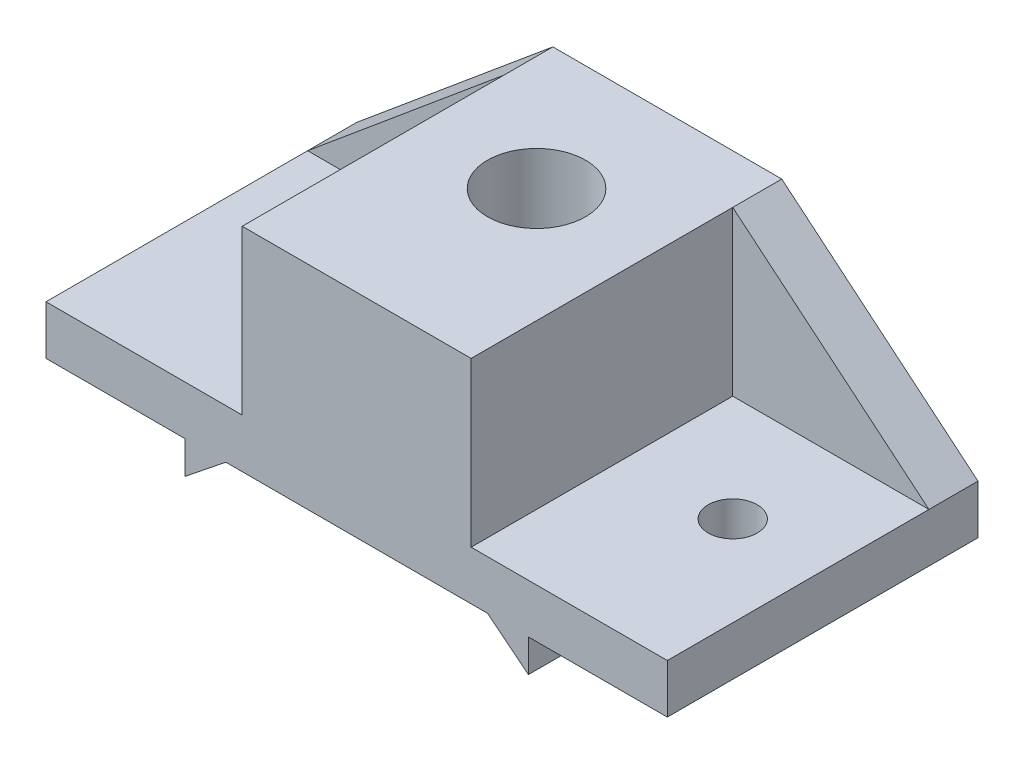
ISO-10303-21;
HEADER;
FILE_DESCRIPTION(('STEP AP214'),'2;1');
FILE_NAME('part.step','',(''),(''),'','','');
FILE_SCHEMA(('AUTOMOTIVE_DESIGN { 1 0 10303 214 1 1 1 1 }'));
ENDSEC;
DATA;
#1=APPLICATION_CONTEXT('core data for automotive mechanical design processes');
#2=APPLICATION_PROTOCOL_DEFINITION('international standard','automotive_design',2000,#1);
#3=PRODUCT_CONTEXT('',#1,'mechanical');
#4=PRODUCT('Part','Part','',(#3));
#5=PRODUCT_RELATED_PRODUCT_CATEGORY('part','',(#4));
#6=PRODUCT_DEFINITION_FORMATION('','',#4);
#7=PRODUCT_DEFINITION_CONTEXT('part definition',#1,'design');
#8=PRODUCT_DEFINITION('design','',#6,#7);
#9=PRODUCT_DEFINITION_SHAPE('','',#8);
#10=(LENGTH_UNIT() NAMED_UNIT(*) SI_UNIT(.MILLI.,.METRE.));
#11=(NAMED_UNIT(*) PLANE_ANGLE_UNIT() SI_UNIT($,.RADIAN.));
#12=(NAMED_UNIT(*) SI_UNIT($,.STERADIAN.) SOLID_ANGLE_UNIT());
#13=UNCERTAINTY_MEASURE_WITH_UNIT(LENGTH_MEASURE(1.E-05),#10,'distance_accuracy_value','');
#14=(GEOMETRIC_REPRESENTATION_CONTEXT(3) GLOBAL_UNCERTAINTY_ASSIGNED_CONTEXT((#13)) GLOBAL_UNIT_ASSIGNED_CONTEXT((#10,
#11,#12)) REPRESENTATION_CONTEXT('',''));
#15=CARTESIAN_POINT('',(0.,0.,0.));
#16=DIRECTION('',(0.,0.,1.));
#17=DIRECTION('',(1.,0.,0.));
#18=AXIS2_PLACEMENT_3D('',#15,#16,#17);
#19=CARTESIAN_POINT('',(17.,0.,38.));
#20=DIRECTION('',(1.,0.,0.));
#21=DIRECTION('',(0.,1.,0.));
#22=AXIS2_PLACEMENT_3D('',#19,#20,#21);
#23=PLANE('',#22);
#24=DIRECTION('',(0.,-1.,0.));
#25=VECTOR('',#24,1.);
#26=CARTESIAN_POINT('',(17.,0.,0.));
#27=LINE('',#26,#25);
#28=CARTESIAN_POINT('',(17.,0.,0.));
#29=VERTEX_POINT('',#28);
#30=CARTESIAN_POINT('',(17.,-4.,0.));
#31=VERTEX_POINT('',#30);
#32=EDGE_CURVE('E172',#29,#31,#27,.T.);
#33=ORIENTED_EDGE('',*,*,#32,.T.);
#34=DIRECTION('',(0.,0.,-1.));
#35=VECTOR('',#34,1.);
#36=CARTESIAN_POINT('',(17.,-4.,38.));
#37=LINE('',#36,#35);
#38=CARTESIAN_POINT('',(17.,-4.,38.));
#39=VERTEX_POINT('',#38);
#40=EDGE_CURVE('E11',#39,#31,#37,.T.);
#41=ORIENTED_EDGE('',*,*,#40,.F.);
#42=DIRECTION('',(0.,-1.,0.));
#43=VECTOR('',#42,1.);
#44=CARTESIAN_POINT('',(17.,0.,38.));
#45=LINE('',#44,#43);
#46=CARTESIAN_POINT('',(17.,0.,38.));
#47=VERTEX_POINT('',#46);
#48=EDGE_CURVE('E311',#47,#39,#45,.T.);
#49=ORIENTED_EDGE('',*,*,#48,.F.);
#50=DIRECTION('',(0.,0.,-1.));
#51=VECTOR('',#50,1.);
#52=CARTESIAN_POINT('',(17.,0.,38.));
#53=LINE('',#52,#51);
#54=EDGE_CURVE('E166',#47,#29,#53,.T.);
#55=ORIENTED_EDGE('',*,*,#54,.T.);
#56=EDGE_LOOP('',(#33,#41,#49,#55));
#57=FACE_BOUND('',#56,.T.);
#58=ADVANCED_FACE('F36',(#57),#23,.F.);
#59=CARTESIAN_POINT('',(8.58536585365853,-10.7317073170732,38.));
#60=DIRECTION('',(-0.624695047554424,0.780868809443031,0.));
#61=DIRECTION('',(-0.780868809443031,-0.624695047554424,0.));
#62=AXIS2_PLACEMENT_3D('',#59,#60,#61);
#63=PLANE('',#62);
#64=DIRECTION('',(0.780868809443031,0.624695047554424,0.));
#65=VECTOR('',#64,1.);
#66=CARTESIAN_POINT('',(8.58536585365853,-10.7317073170732,0.));
#67=LINE('',#66,#65);
#68=CARTESIAN_POINT('',(22.,0.,0.));
#69=VERTEX_POINT('',#68);
#70=EDGE_CURVE('E176',#31,#69,#67,.T.);
#71=ORIENTED_EDGE('',*,*,#70,.T.);
#72=DIRECTION('',(0.,0.,-1.));
#73=VECTOR('',#72,1.);
#74=CARTESIAN_POINT('',(22.,0.,38.));
#75=LINE('',#74,#73);
#76=CARTESIAN_POINT('',(22.,0.,38.));
#77=VERTEX_POINT('',#76);
#78=EDGE_CURVE('E46',#77,#69,#75,.T.);
#79=ORIENTED_EDGE('',*,*,#78,.F.);
#80=DIRECTION('',(0.780868809443031,0.624695047554424,0.));
#81=VECTOR('',#80,1.);
#82=CARTESIAN_POINT('',(8.58536585365853,-10.7317073170732,38.));
#83=LINE('',#82,#81);
#84=EDGE_CURVE('E101',#39,#77,#83,.T.);
#85=ORIENTED_EDGE('',*,*,#84,.F.);
#86=ORIENTED_EDGE('',*,*,#40,.T.);
#87=EDGE_LOOP('',(#71,#79,#85,#86));
#88=FACE_BOUND('',#87,.T.);
#89=ADVANCED_FACE('F404',(#88),#63,.F.);
#90=CARTESIAN_POINT('',(0.,0.,38.));
#91=DIRECTION('',(0.,1.,0.));
#92=DIRECTION('',(0.,0.,1.));
#93=AXIS2_PLACEMENT_3D('',#90,#91,#92);
#94=PLANE('',#93);
#95=CARTESIAN_POINT('',(38.,0.,16.));
#96=DIRECTION('',(0.,1.,0.));
#97=DIRECTION('',(0.,0.,1.));
#98=AXIS2_PLACEMENT_3D('',#95,#96,#97);
#99=CIRCLE('',#98,6.);
#100=CARTESIAN_POINT('',(38.,0.,22.));
#101=VERTEX_POINT('',#100);
#102=EDGE_CURVE('E253',#101,#101,#99,.T.);
#103=ORIENTED_EDGE('',*,*,#102,.T.);
#104=EDGE_LOOP('',(#103));
#105=FACE_BOUND('',#104,.T.);
#106=DIRECTION('',(1.,0.,0.));
#107=VECTOR('',#106,1.);
#108=CARTESIAN_POINT('',(0.,0.,0.));
#109=LINE('',#108,#107);
#110=CARTESIAN_POINT('',(54.,0.,0.));
#111=VERTEX_POINT('',#110);
#112=EDGE_CURVE('E180',#69,#111,#109,.T.);
#113=ORIENTED_EDGE('',*,*,#112,.T.);
#114=DIRECTION('',(0.,0.,-1.));
#115=VECTOR('',#114,1.);
#116=CARTESIAN_POINT('',(54.,0.,38.));
#117=LINE('',#116,#115);
#118=CARTESIAN_POINT('',(54.,0.,38.));
#119=VERTEX_POINT('',#118);
#120=EDGE_CURVE('E237',#119,#111,#117,.T.);
#121=ORIENTED_EDGE('',*,*,#120,.F.);
#122=DIRECTION('',(1.,0.,0.));
#123=VECTOR('',#122,1.);
#124=CARTESIAN_POINT('',(0.,0.,38.));
#125=LINE('',#124,#123);
#126=EDGE_CURVE('E169',#77,#119,#125,.T.);
#127=ORIENTED_EDGE('',*,*,#126,.F.);
#128=ORIENTED_EDGE('',*,*,#78,.T.);
#129=EDGE_LOOP('',(#113,#121,#127,#128));
#130=FACE_BOUND('',#129,.T.);
#131=ADVANCED_FACE('F409',(#105,#130),#94,.F.);
#132=CARTESIAN_POINT('',(21.0731707317074,26.3414634146342,38.));
#133=DIRECTION('',(-0.624695047554425,-0.78086880944303,0.));
#134=DIRECTION('',(0.78086880944303,-0.624695047554425,0.));
#135=AXIS2_PLACEMENT_3D('',#132,#133,#134);
#136=PLANE('',#135);
#137=DIRECTION('',(-0.78086880944303,0.624695047554425,0.));
#138=VECTOR('',#137,1.);
#139=CARTESIAN_POINT('',(21.0731707317074,26.3414634146342,0.));
#140=LINE('',#139,#138);
#141=CARTESIAN_POINT('',(59.,-4.,0.));
#142=VERTEX_POINT('',#141);
#143=EDGE_CURVE('E184',#142,#111,#140,.T.);
#144=ORIENTED_EDGE('',*,*,#143,.F.);
#145=DIRECTION('',(0.,0.,-1.));
#146=VECTOR('',#145,1.);
#147=CARTESIAN_POINT('',(59.,-4.,38.));
#148=LINE('',#147,#146);
#149=CARTESIAN_POINT('',(59.,-4.,38.));
#150=VERTEX_POINT('',#149);
#151=EDGE_CURVE('E234',#150,#142,#148,.T.);
#152=ORIENTED_EDGE('',*,*,#151,.F.);
#153=DIRECTION('',(-0.78086880944303,0.624695047554425,0.));
#154=VECTOR('',#153,1.);
#155=CARTESIAN_POINT('',(21.0731707317074,26.3414634146342,38.));
#156=LINE('',#155,#154);
#157=EDGE_CURVE('E317',#150,#119,#156,.T.);
#158=ORIENTED_EDGE('',*,*,#157,.T.);
#159=ORIENTED_EDGE('',*,*,#120,.T.);
#160=EDGE_LOOP('',(#144,#152,#158,#159));
#161=FACE_BOUND('',#160,.T.);
#162=ADVANCED_FACE('F481',(#161),#136,.T.);
#163=CARTESIAN_POINT('',(59.,0.,38.));
#164=DIRECTION('',(1.,0.,0.));
#165=DIRECTION('',(0.,0.,-1.));
#166=AXIS2_PLACEMENT_3D('',#163,#164,#165);
#167=PLANE('',#166);
#168=DIRECTION('',(0.,-1.,0.));
#169=VECTOR('',#168,1.);
#170=CARTESIAN_POINT('',(59.,0.,0.));
#171=LINE('',#170,#169);
#172=CARTESIAN_POINT('',(59.,0.,0.));
#173=VERTEX_POINT('',#172);
#174=EDGE_CURVE('E189',#173,#142,#171,.T.);
#175=ORIENTED_EDGE('',*,*,#174,.F.);
#176=DIRECTION('',(0.,0.,-1.));
#177=VECTOR('',#176,1.);
#178=CARTESIAN_POINT('',(59.,0.,38.));
#179=LINE('',#178,#177);
#180=CARTESIAN_POINT('',(59.,0.,38.));
#181=VERTEX_POINT('',#180);
#182=EDGE_CURVE('E231',#181,#173,#179,.T.);
#183=ORIENTED_EDGE('',*,*,#182,.F.);
#184=DIRECTION('',(0.,-1.,0.));
#185=VECTOR('',#184,1.);
#186=CARTESIAN_POINT('',(59.,0.,38.));
#187=LINE('',#186,#185);
#188=EDGE_CURVE('E321',#181,#150,#187,.T.);
#189=ORIENTED_EDGE('',*,*,#188,.T.);
#190=ORIENTED_EDGE('',*,*,#151,.T.);
#191=EDGE_LOOP('',(#175,#183,#189,#190));
#192=FACE_BOUND('',#191,.T.);
#193=ADVANCED_FACE('F421',(#192),#167,.T.);
#194=CARTESIAN_POINT('',(65.,0.,19.));
#195=DIRECTION('',(0.,1.,0.));
#196=DIRECTION('',(0.,0.,1.));
#197=AXIS2_PLACEMENT_3D('',#194,#195,#196);
#198=CIRCLE('',#197,3.00000000000001);
#199=CARTESIAN_POINT('',(65.,0.,22.));
#200=VERTEX_POINT('',#199);
#201=EDGE_CURVE('E264',#200,#200,#198,.T.);
#202=ORIENTED_EDGE('',*,*,#201,.T.);
#203=EDGE_LOOP('',(#202));
#204=FACE_BOUND('',#203,.T.);
#205=CARTESIAN_POINT('',(76.,0.,0.));
#206=VERTEX_POINT('',#205);
#207=EDGE_CURVE('E185',#173,#206,#109,.T.);
#208=ORIENTED_EDGE('',*,*,#207,.T.);
#209=DIRECTION('',(0.,0.,-1.));
#210=VECTOR('',#209,1.);
#211=CARTESIAN_POINT('',(76.,0.,38.));
#212=LINE('',#211,#210);
#213=CARTESIAN_POINT('',(76.,0.,38.));
#214=VERTEX_POINT('',#213);
#215=EDGE_CURVE('E227',#214,#206,#212,.T.);
#216=ORIENTED_EDGE('',*,*,#215,.F.);
#217=EDGE_CURVE('E168',#181,#214,#125,.T.);
#218=ORIENTED_EDGE('',*,*,#217,.F.);
#219=ORIENTED_EDGE('',*,*,#182,.T.);
#220=EDGE_LOOP('',(#208,#216,#218,#219));
#221=FACE_BOUND('',#220,.T.);
#222=ADVANCED_FACE('F425',(#204,#221),#94,.F.);
#223=CARTESIAN_POINT('',(76.,0.,38.));
#224=DIRECTION('',(-1.,0.,0.));
#225=DIRECTION('',(0.,0.,1.));
#226=AXIS2_PLACEMENT_3D('',#223,#224,#225);
#227=PLANE('',#226);
#228=DIRECTION('',(0.,1.,0.));
#229=VECTOR('',#228,1.);
#230=CARTESIAN_POINT('',(76.,0.,0.));
#231=LINE('',#230,#229);
#232=CARTESIAN_POINT('',(76.,6.,0.));
#233=VERTEX_POINT('',#232);
#234=EDGE_CURVE('E193',#206,#233,#231,.T.);
#235=ORIENTED_EDGE('',*,*,#234,.T.);
#236=DIRECTION('',(0.,0.,-1.));
#237=VECTOR('',#236,1.);
#238=CARTESIAN_POINT('',(76.,6.,6.));
#239=LINE('',#238,#237);
#240=CARTESIAN_POINT('',(76.,6.,6.));
#241=VERTEX_POINT('',#240);
#242=EDGE_CURVE('E177',#241,#233,#239,.T.);
#243=ORIENTED_EDGE('',*,*,#242,.F.);
#244=DIRECTION('',(0.,0.,-1.));
#245=VECTOR('',#244,1.);
#246=CARTESIAN_POINT('',(76.,6.,38.));
#247=LINE('',#246,#245);
#248=CARTESIAN_POINT('',(76.,6.,38.));
#249=VERTEX_POINT('',#248);
#250=EDGE_CURVE('E223',#249,#241,#247,.T.);
#251=ORIENTED_EDGE('',*,*,#250,.F.);
#252=DIRECTION('',(0.,1.,0.));
#253=VECTOR('',#252,1.);
#254=CARTESIAN_POINT('',(76.,0.,38.));
#255=LINE('',#254,#253);
#256=EDGE_CURVE('E325',#214,#249,#255,.T.);
#257=ORIENTED_EDGE('',*,*,#256,.F.);
#258=ORIENTED_EDGE('',*,*,#215,.T.);
#259=EDGE_LOOP('',(#235,#243,#251,#257,#258));
#260=FACE_BOUND('',#259,.T.);
#261=ADVANCED_FACE('F379',(#260),#227,.F.);
#262=CARTESIAN_POINT('',(0.,6.,38.));
#263=DIRECTION('',(0.,1.,0.));
#264=DIRECTION('',(0.,0.,1.));
#265=AXIS2_PLACEMENT_3D('',#262,#263,#264);
#266=PLANE('',#265);
#267=CARTESIAN_POINT('',(65.,6.,19.));
#268=DIRECTION('',(0.,1.,0.));
#269=DIRECTION('',(0.,0.,1.));
#270=AXIS2_PLACEMENT_3D('',#267,#268,#269);
#271=CIRCLE('',#270,3.00000000000001);
#272=CARTESIAN_POINT('',(65.,6.,22.));
#273=VERTEX_POINT('',#272);
#274=EDGE_CURVE('E39',#273,#273,#271,.T.);
#275=ORIENTED_EDGE('',*,*,#274,.F.);
#276=EDGE_LOOP('',(#275));
#277=FACE_BOUND('',#276,.T.);
#278=DIRECTION('',(1.,0.,0.));
#279=VECTOR('',#278,1.);
#280=CARTESIAN_POINT('',(0.,6.,6.));
#281=LINE('',#280,#279);
#282=CARTESIAN_POINT('',(52.,6.,6.));
#283=VERTEX_POINT('',#282);
#284=EDGE_CURVE('E294',#283,#241,#281,.T.);
#285=ORIENTED_EDGE('',*,*,#284,.F.);
#286=DIRECTION('',(0.,0.,-1.));
#287=VECTOR('',#286,1.);
#288=CARTESIAN_POINT('',(52.,6.,38.));
#289=LINE('',#288,#287);
#290=CARTESIAN_POINT('',(52.,6.,38.));
#291=VERTEX_POINT('',#290);
#292=EDGE_CURVE('E219',#291,#283,#289,.T.);
#293=ORIENTED_EDGE('',*,*,#292,.F.);
#294=DIRECTION('',(1.,0.,0.));
#295=VECTOR('',#294,1.);
#296=CARTESIAN_POINT('',(0.,6.,38.));
#297=LINE('',#296,#295);
#298=EDGE_CURVE('E328',#291,#249,#297,.T.);
#299=ORIENTED_EDGE('',*,*,#298,.T.);
#300=ORIENTED_EDGE('',*,*,#250,.T.);
#301=EDGE_LOOP('',(#285,#293,#299,#300));
#302=FACE_BOUND('',#301,.T.);
#303=ADVANCED_FACE('F377',(#277,#302),#266,.T.);
#304=CARTESIAN_POINT('',(52.,0.,38.));
#305=DIRECTION('',(-1.,0.,0.));
#306=DIRECTION('',(0.,-1.,0.));
#307=AXIS2_PLACEMENT_3D('',#304,#305,#306);
#308=PLANE('',#307);
#309=ORIENTED_EDGE('',*,*,#292,.T.);
#310=DIRECTION('',(0.,1.,0.));
#311=VECTOR('',#310,1.);
#312=CARTESIAN_POINT('',(52.,0.,6.));
#313=LINE('',#312,#311);
#314=CARTESIAN_POINT('',(52.,26.,6.));
#315=VERTEX_POINT('',#314);
#316=EDGE_CURVE('E290',#283,#315,#313,.T.);
#317=ORIENTED_EDGE('',*,*,#316,.T.);
#318=DIRECTION('',(0.,0.,-1.));
#319=VECTOR('',#318,1.);
#320=CARTESIAN_POINT('',(52.,26.,38.));
#321=LINE('',#320,#319);
#322=CARTESIAN_POINT('',(52.,26.,38.));
#323=VERTEX_POINT('',#322);
#324=EDGE_CURVE('E215',#323,#315,#321,.T.);
#325=ORIENTED_EDGE('',*,*,#324,.F.);
#326=DIRECTION('',(0.,1.,0.));
#327=VECTOR('',#326,1.);
#328=CARTESIAN_POINT('',(52.,0.,38.));
#329=LINE('',#328,#327);
#330=EDGE_CURVE('E332',#291,#323,#329,.T.);
#331=ORIENTED_EDGE('',*,*,#330,.F.);
#332=EDGE_LOOP('',(#309,#317,#325,#331));
#333=FACE_BOUND('',#332,.T.);
#334=ADVANCED_FACE('F369',(#333),#308,.F.);
#335=CARTESIAN_POINT('',(0.,26.,38.));
#336=DIRECTION('',(0.,1.,0.));
#337=DIRECTION('',(0.,0.,1.));
#338=AXIS2_PLACEMENT_3D('',#335,#336,#337);
#339=PLANE('',#338);
#340=CARTESIAN_POINT('',(38.,26.,16.));
#341=DIRECTION('',(0.,1.,0.));
#342=DIRECTION('',(0.,0.,1.));
#343=AXIS2_PLACEMENT_3D('',#340,#341,#342);
#344=CIRCLE('',#343,6.);
#345=CARTESIAN_POINT('',(38.,26.,22.));
#346=VERTEX_POINT('',#345);
#347=EDGE_CURVE('E246',#346,#346,#344,.T.);
#348=ORIENTED_EDGE('',*,*,#347,.F.);
#349=EDGE_LOOP('',(#348));
#350=FACE_BOUND('',#349,.T.);
#351=DIRECTION('',(1.,0.,0.));
#352=VECTOR('',#351,1.);
#353=CARTESIAN_POINT('',(0.,26.,0.));
#354=LINE('',#353,#352);
#355=CARTESIAN_POINT('',(24.,26.,0.));
#356=VERTEX_POINT('',#355);
#357=CARTESIAN_POINT('',(52.,26.,0.));
#358=VERTEX_POINT('',#357);
#359=EDGE_CURVE('E197',#356,#358,#354,.T.);
#360=ORIENTED_EDGE('',*,*,#359,.F.);
#361=DIRECTION('',(0.,0.,-1.));
#362=VECTOR('',#361,1.);
#363=CARTESIAN_POINT('',(24.,26.,6.));
#364=LINE('',#363,#362);
#365=CARTESIAN_POINT('',(24.,26.,6.));
#366=VERTEX_POINT('',#365);
#367=EDGE_CURVE('E285',#366,#356,#364,.T.);
#368=ORIENTED_EDGE('',*,*,#367,.F.);
#369=DIRECTION('',(0.,0.,-1.));
#370=VECTOR('',#369,1.);
#371=CARTESIAN_POINT('',(24.,26.,38.));
#372=LINE('',#371,#370);
#373=CARTESIAN_POINT('',(24.,26.,38.));
#374=VERTEX_POINT('',#373);
#375=EDGE_CURVE('E211',#374,#366,#372,.T.);
#376=ORIENTED_EDGE('',*,*,#375,.F.);
#377=DIRECTION('',(1.,0.,0.));
#378=VECTOR('',#377,1.);
#379=CARTESIAN_POINT('',(0.,26.,38.));
#380=LINE('',#379,#378);
#381=EDGE_CURVE('E335',#374,#323,#380,.T.);
#382=ORIENTED_EDGE('',*,*,#381,.T.);
#383=ORIENTED_EDGE('',*,*,#324,.T.);
#384=DIRECTION('',(0.,0.,-1.));
#385=VECTOR('',#384,1.);
#386=CARTESIAN_POINT('',(52.,26.,6.));
#387=LINE('',#386,#385);
#388=EDGE_CURVE('E302',#315,#358,#387,.T.);
#389=ORIENTED_EDGE('',*,*,#388,.T.);
#390=EDGE_LOOP('',(#360,#368,#376,#382,#383,#389));
#391=FACE_BOUND('',#390,.T.);
#392=ADVANCED_FACE('F371',(#350,#391),#339,.T.);
#393=CARTESIAN_POINT('',(24.,0.,38.));
#394=DIRECTION('',(-1.,0.,0.));
#395=DIRECTION('',(0.,-1.,0.));
#396=AXIS2_PLACEMENT_3D('',#393,#394,#395);
#397=PLANE('',#396);
#398=DIRECTION('',(0.,1.,0.));
#399=VECTOR('',#398,1.);
#400=CARTESIAN_POINT('',(24.,0.,6.));
#401=LINE('',#400,#399);
#402=CARTESIAN_POINT('',(24.,6.,6.));
#403=VERTEX_POINT('',#402);
#404=EDGE_CURVE('E271',#403,#366,#401,.T.);
#405=ORIENTED_EDGE('',*,*,#404,.F.);
#406=DIRECTION('',(0.,0.,-1.));
#407=VECTOR('',#406,1.);
#408=CARTESIAN_POINT('',(24.,6.,38.));
#409=LINE('',#408,#407);
#410=CARTESIAN_POINT('',(24.,6.,38.));
#411=VERTEX_POINT('',#410);
#412=EDGE_CURVE('E150',#411,#403,#409,.T.);
#413=ORIENTED_EDGE('',*,*,#412,.F.);
#414=DIRECTION('',(0.,1.,0.));
#415=VECTOR('',#414,1.);
#416=CARTESIAN_POINT('',(24.,0.,38.));
#417=LINE('',#416,#415);
#418=EDGE_CURVE('E157',#411,#374,#417,.T.);
#419=ORIENTED_EDGE('',*,*,#418,.T.);
#420=ORIENTED_EDGE('',*,*,#375,.T.);
#421=EDGE_LOOP('',(#405,#413,#419,#420));
#422=FACE_BOUND('',#421,.T.);
#423=ADVANCED_FACE('F342',(#422),#397,.T.);
#424=CARTESIAN_POINT('',(0.,6.,38.));
#425=DIRECTION('',(0.,1.,0.));
#426=DIRECTION('',(0.,0.,1.));
#427=AXIS2_PLACEMENT_3D('',#424,#425,#426);
#428=PLANE('',#427);
#429=CARTESIAN_POINT('',(11.,6.,19.));
#430=DIRECTION('',(0.,1.,0.));
#431=DIRECTION('',(0.,0.,1.));
#432=AXIS2_PLACEMENT_3D('',#429,#430,#431);
#433=CIRCLE('',#432,3.00000000000001);
#434=CARTESIAN_POINT('',(11.,6.,22.));
#435=VERTEX_POINT('',#434);
#436=EDGE_CURVE('E245',#435,#435,#433,.T.);
#437=ORIENTED_EDGE('',*,*,#436,.F.);
#438=EDGE_LOOP('',(#437));
#439=FACE_BOUND('',#438,.T.);
#440=DIRECTION('',(1.,0.,0.));
#441=VECTOR('',#440,1.);
#442=CARTESIAN_POINT('',(0.,6.,6.));
#443=LINE('',#442,#441);
#444=CARTESIAN_POINT('',(0.,6.,6.));
#445=VERTEX_POINT('',#444);
#446=EDGE_CURVE('E145',#445,#403,#443,.T.);
#447=ORIENTED_EDGE('',*,*,#446,.F.);
#448=DIRECTION('',(0.,0.,-1.));
#449=VECTOR('',#448,1.);
#450=CARTESIAN_POINT('',(0.,6.,38.));
#451=LINE('',#450,#449);
#452=CARTESIAN_POINT('',(0.,6.,38.));
#453=VERTEX_POINT('',#452);
#454=EDGE_CURVE('E138',#453,#445,#451,.T.);
#455=ORIENTED_EDGE('',*,*,#454,.F.);
#456=DIRECTION('',(1.,0.,0.));
#457=VECTOR('',#456,1.);
#458=CARTESIAN_POINT('',(0.,6.,38.));
#459=LINE('',#458,#457);
#460=EDGE_CURVE('E142',#453,#411,#459,.T.);
#461=ORIENTED_EDGE('',*,*,#460,.T.);
#462=ORIENTED_EDGE('',*,*,#412,.T.);
#463=EDGE_LOOP('',(#447,#455,#461,#462));
#464=FACE_BOUND('',#463,.T.);
#465=ADVANCED_FACE('F140',(#439,#464),#428,.T.);
#466=CARTESIAN_POINT('',(0.,0.,38.));
#467=DIRECTION('',(-1.,0.,0.));
#468=DIRECTION('',(0.,0.,1.));
#469=AXIS2_PLACEMENT_3D('',#466,#467,#468);
#470=PLANE('',#469);
#471=DIRECTION('',(0.,1.,0.));
#472=VECTOR('',#471,1.);
#473=CARTESIAN_POINT('',(0.,0.,0.));
#474=LINE('',#473,#472);
#475=CARTESIAN_POINT('',(0.,0.,0.));
#476=VERTEX_POINT('',#475);
#477=CARTESIAN_POINT('',(0.,6.,0.));
#478=VERTEX_POINT('',#477);
#479=EDGE_CURVE('E201',#476,#478,#474,.T.);
#480=ORIENTED_EDGE('',*,*,#479,.F.);
#481=DIRECTION('',(0.,0.,-1.));
#482=VECTOR('',#481,1.);
#483=CARTESIAN_POINT('',(0.,0.,38.));
#484=LINE('',#483,#482);
#485=CARTESIAN_POINT('',(0.,0.,38.));
#486=VERTEX_POINT('',#485);
#487=EDGE_CURVE('E90',#486,#476,#484,.T.);
#488=ORIENTED_EDGE('',*,*,#487,.F.);
#489=DIRECTION('',(0.,1.,0.));
#490=VECTOR('',#489,1.);
#491=CARTESIAN_POINT('',(0.,0.,38.));
#492=LINE('',#491,#490);
#493=EDGE_CURVE('E154',#486,#453,#492,.T.);
#494=ORIENTED_EDGE('',*,*,#493,.T.);
#495=ORIENTED_EDGE('',*,*,#454,.T.);
#496=DIRECTION('',(0.,0.,-1.));
#497=VECTOR('',#496,1.);
#498=CARTESIAN_POINT('',(0.,6.,6.));
#499=LINE('',#498,#497);
#500=EDGE_CURVE('E279',#445,#478,#499,.T.);
#501=ORIENTED_EDGE('',*,*,#500,.T.);
#502=EDGE_LOOP('',(#480,#488,#494,#495,#501));
#503=FACE_BOUND('',#502,.T.);
#504=ADVANCED_FACE('F161',(#503),#470,.T.);
#505=CARTESIAN_POINT('',(11.,0.,19.));
#506=DIRECTION('',(0.,1.,0.));
#507=DIRECTION('',(0.,0.,1.));
#508=AXIS2_PLACEMENT_3D('',#505,#506,#507);
#509=CIRCLE('',#508,3.00000000000001);
#510=CARTESIAN_POINT('',(11.,0.,22.));
#511=VERTEX_POINT('',#510);
#512=EDGE_CURVE('E242',#511,#511,#509,.T.);
#513=ORIENTED_EDGE('',*,*,#512,.T.);
#514=EDGE_LOOP('',(#513));
#515=FACE_BOUND('',#514,.T.);
#516=EDGE_CURVE('E93',#476,#29,#109,.T.);
#517=ORIENTED_EDGE('',*,*,#516,.T.);
#518=ORIENTED_EDGE('',*,*,#54,.F.);
#519=EDGE_CURVE('E55',#486,#47,#125,.T.);
#520=ORIENTED_EDGE('',*,*,#519,.F.);
#521=ORIENTED_EDGE('',*,*,#487,.T.);
#522=EDGE_LOOP('',(#517,#518,#520,#521));
#523=FACE_BOUND('',#522,.T.);
#524=ADVANCED_FACE('F488',(#515,#523),#94,.F.);
#525=CARTESIAN_POINT('',(0.,0.,38.));
#526=DIRECTION('',(0.,0.,1.));
#527=DIRECTION('',(1.,0.,0.));
#528=AXIS2_PLACEMENT_3D('',#525,#526,#527);
#529=PLANE('',#528);
#530=ORIENTED_EDGE('',*,*,#48,.T.);
#531=ORIENTED_EDGE('',*,*,#84,.T.);
#532=ORIENTED_EDGE('',*,*,#126,.T.);
#533=ORIENTED_EDGE('',*,*,#157,.F.);
#534=ORIENTED_EDGE('',*,*,#188,.F.);
#535=ORIENTED_EDGE('',*,*,#217,.T.);
#536=ORIENTED_EDGE('',*,*,#256,.T.);
#537=ORIENTED_EDGE('',*,*,#298,.F.);
#538=ORIENTED_EDGE('',*,*,#330,.T.);
#539=ORIENTED_EDGE('',*,*,#381,.F.);
#540=ORIENTED_EDGE('',*,*,#418,.F.);
#541=ORIENTED_EDGE('',*,*,#460,.F.);
#542=ORIENTED_EDGE('',*,*,#493,.F.);
#543=ORIENTED_EDGE('',*,*,#519,.T.);
#544=EDGE_LOOP('',(#530,#531,#532,#533,#534,#535,#536,#537,#538,#539,#540,#541,#542,#543));
#545=FACE_BOUND('',#544,.T.);
#546=ADVANCED_FACE('F153',(#545),#529,.T.);
#547=CARTESIAN_POINT('',(0.,0.,0.));
#548=DIRECTION('',(0.,0.,1.));
#549=DIRECTION('',(1.,0.,0.));
#550=AXIS2_PLACEMENT_3D('',#547,#548,#549);
#551=PLANE('',#550);
#552=ORIENTED_EDGE('',*,*,#359,.T.);
#553=DIRECTION('',(0.768221279597376,-0.64018439966448,0.));
#554=VECTOR('',#553,1.);
#555=CARTESIAN_POINT('',(34.0983606557377,40.9180327868852,0.));
#556=LINE('',#555,#554);
#557=EDGE_CURVE('E289',#358,#233,#556,.T.);
#558=ORIENTED_EDGE('',*,*,#557,.T.);
#559=ORIENTED_EDGE('',*,*,#234,.F.);
#560=ORIENTED_EDGE('',*,*,#207,.F.);
#561=ORIENTED_EDGE('',*,*,#174,.T.);
#562=ORIENTED_EDGE('',*,*,#143,.T.);
#563=ORIENTED_EDGE('',*,*,#112,.F.);
#564=ORIENTED_EDGE('',*,*,#70,.F.);
#565=ORIENTED_EDGE('',*,*,#32,.F.);
#566=ORIENTED_EDGE('',*,*,#516,.F.);
#567=ORIENTED_EDGE('',*,*,#479,.T.);
#568=DIRECTION('',(-0.768221279597376,-0.64018439966448,0.));
#569=VECTOR('',#568,1.);
#570=CARTESIAN_POINT('',(-2.95081967213115,3.54098360655738,0.));
#571=LINE('',#570,#569);
#572=EDGE_CURVE('E268',#356,#478,#571,.T.);
#573=ORIENTED_EDGE('',*,*,#572,.F.);
#574=EDGE_LOOP('',(#552,#558,#559,#560,#561,#562,#563,#564,#565,#566,#567,#573));
#575=FACE_BOUND('',#574,.T.);
#576=ADVANCED_FACE('F384',(#575),#551,.F.);
#577=CARTESIAN_POINT('',(34.0983606557377,40.9180327868852,6.));
#578=DIRECTION('',(0.64018439966448,0.768221279597376,0.));
#579=DIRECTION('',(-0.768221279597376,0.64018439966448,0.));
#580=AXIS2_PLACEMENT_3D('',#577,#578,#579);
#581=PLANE('',#580);
#582=ORIENTED_EDGE('',*,*,#557,.F.);
#583=ORIENTED_EDGE('',*,*,#388,.F.);
#584=DIRECTION('',(0.768221279597376,-0.64018439966448,0.));
#585=VECTOR('',#584,1.);
#586=CARTESIAN_POINT('',(34.0983606557377,40.9180327868852,6.));
#587=LINE('',#586,#585);
#588=EDGE_CURVE('E298',#315,#241,#587,.T.);
#589=ORIENTED_EDGE('',*,*,#588,.T.);
#590=ORIENTED_EDGE('',*,*,#242,.T.);
#591=EDGE_LOOP('',(#582,#583,#589,#590));
#592=FACE_BOUND('',#591,.T.);
#593=ADVANCED_FACE('F360',(#592),#581,.T.);
#594=CARTESIAN_POINT('',(0.,0.,6.));
#595=DIRECTION('',(0.,0.,1.));
#596=DIRECTION('',(1.,0.,0.));
#597=AXIS2_PLACEMENT_3D('',#594,#595,#596);
#598=PLANE('',#597);
#599=ORIENTED_EDGE('',*,*,#316,.F.);
#600=ORIENTED_EDGE('',*,*,#284,.T.);
#601=ORIENTED_EDGE('',*,*,#588,.F.);
#602=EDGE_LOOP('',(#599,#600,#601));
#603=FACE_BOUND('',#602,.T.);
#604=ADVANCED_FACE('F365',(#603),#598,.T.);
#605=CARTESIAN_POINT('',(-2.95081967213115,3.54098360655738,6.));
#606=DIRECTION('',(0.64018439966448,-0.768221279597376,0.));
#607=DIRECTION('',(0.768221279597376,0.64018439966448,0.));
#608=AXIS2_PLACEMENT_3D('',#605,#606,#607);
#609=PLANE('',#608);
#610=ORIENTED_EDGE('',*,*,#572,.T.);
#611=ORIENTED_EDGE('',*,*,#500,.F.);
#612=DIRECTION('',(-0.768221279597376,-0.64018439966448,0.));
#613=VECTOR('',#612,1.);
#614=CARTESIAN_POINT('',(-2.95081967213115,3.54098360655738,6.));
#615=LINE('',#614,#613);
#616=EDGE_CURVE('E275',#366,#445,#615,.T.);
#617=ORIENTED_EDGE('',*,*,#616,.F.);
#618=ORIENTED_EDGE('',*,*,#367,.T.);
#619=EDGE_LOOP('',(#610,#611,#617,#618));
#620=FACE_BOUND('',#619,.T.);
#621=ADVANCED_FACE('F388',(#620),#609,.F.);
#622=CARTESIAN_POINT('',(0.,0.,6.));
#623=DIRECTION('',(0.,0.,1.));
#624=DIRECTION('',(1.,0.,0.));
#625=AXIS2_PLACEMENT_3D('',#622,#623,#624);
#626=PLANE('',#625);
#627=ORIENTED_EDGE('',*,*,#446,.T.);
#628=ORIENTED_EDGE('',*,*,#404,.T.);
#629=ORIENTED_EDGE('',*,*,#616,.T.);
#630=EDGE_LOOP('',(#627,#628,#629));
#631=FACE_BOUND('',#630,.T.);
#632=ADVANCED_FACE('F390',(#631),#626,.T.);
#633=CARTESIAN_POINT('',(11.,-4.,19.));
#634=DIRECTION('',(0.,1.,0.));
#635=DIRECTION('',(0.,0.,1.));
#636=AXIS2_PLACEMENT_3D('',#633,#634,#635);
#637=CYLINDRICAL_SURFACE('',#636,3.00000000000001);
#638=ORIENTED_EDGE('',*,*,#436,.T.);
#639=EDGE_LOOP('',(#638));
#640=FACE_BOUND('',#639,.T.);
#641=ORIENTED_EDGE('',*,*,#512,.F.);
#642=EDGE_LOOP('',(#641));
#643=FACE_BOUND('',#642,.T.);
#644=ADVANCED_FACE('F392',(#640,#643),#637,.F.);
#645=CARTESIAN_POINT('',(38.,-4.,16.));
#646=DIRECTION('',(0.,1.,0.));
#647=DIRECTION('',(0.,0.,1.));
#648=AXIS2_PLACEMENT_3D('',#645,#646,#647);
#649=CYLINDRICAL_SURFACE('',#648,6.);
#650=ORIENTED_EDGE('',*,*,#347,.T.);
#651=EDGE_LOOP('',(#650));
#652=FACE_BOUND('',#651,.T.);
#653=ORIENTED_EDGE('',*,*,#102,.F.);
#654=EDGE_LOOP('',(#653));
#655=FACE_BOUND('',#654,.T.);
#656=ADVANCED_FACE('F398',(#652,#655),#649,.F.);
#657=CARTESIAN_POINT('',(65.,-4.,19.));
#658=DIRECTION('',(0.,1.,0.));
#659=DIRECTION('',(0.,0.,1.));
#660=AXIS2_PLACEMENT_3D('',#657,#658,#659);
#661=CYLINDRICAL_SURFACE('',#660,3.00000000000001);
#662=ORIENTED_EDGE('',*,*,#274,.T.);
#663=EDGE_LOOP('',(#662));
#664=FACE_BOUND('',#663,.T.);
#665=ORIENTED_EDGE('',*,*,#201,.F.);
#666=EDGE_LOOP('',(#665));
#667=FACE_BOUND('',#666,.T.);
#668=ADVANCED_FACE('F466',(#664,#667),#661,.F.);
#669=CLOSED_SHELL('',(#58,#89,#131,#162,#193,#222,#261,#303,#334,#392,#423,#465,#504,#524,#546,
#576,#593,#604,#621,#632,#644,#656,#668));
#670=MANIFOLD_SOLID_BREP('B2',#669);
#671=ADVANCED_BREP_SHAPE_REPRESENTATION('',(#18,#670),#14);
#672=SHAPE_DEFINITION_REPRESENTATION(#9,#671);
ENDSEC;
END-ISO-10303-21;
